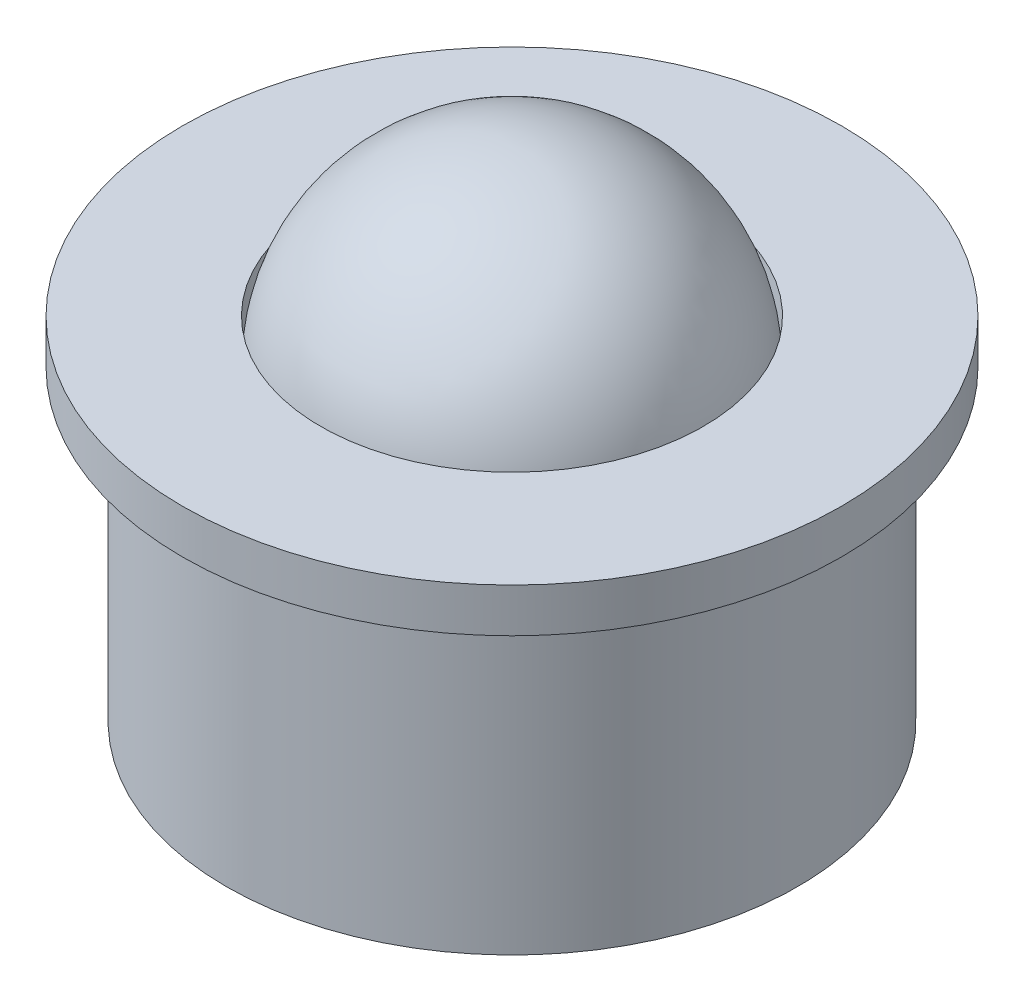
ISO-10303-21;
HEADER;
FILE_DESCRIPTION(('STEP AP214'),'2;1');
FILE_NAME('part.step','',(''),(''),'','','');
FILE_SCHEMA(('AUTOMOTIVE_DESIGN { 1 0 10303 214 1 1 1 1 }'));
ENDSEC;
DATA;
#1=APPLICATION_CONTEXT('core data for automotive mechanical design processes');
#2=APPLICATION_PROTOCOL_DEFINITION('international standard','automotive_design',2000,#1);
#3=PRODUCT_CONTEXT('',#1,'mechanical');
#4=PRODUCT('Part','Part','',(#3));
#5=PRODUCT_RELATED_PRODUCT_CATEGORY('part','',(#4));
#6=PRODUCT_DEFINITION_FORMATION('','',#4);
#7=PRODUCT_DEFINITION_CONTEXT('part definition',#1,'design');
#8=PRODUCT_DEFINITION('design','',#6,#7);
#9=PRODUCT_DEFINITION_SHAPE('','',#8);
#10=(LENGTH_UNIT() NAMED_UNIT(*) SI_UNIT(.MILLI.,.METRE.));
#11=(NAMED_UNIT(*) PLANE_ANGLE_UNIT() SI_UNIT($,.RADIAN.));
#12=(NAMED_UNIT(*) SI_UNIT($,.STERADIAN.) SOLID_ANGLE_UNIT());
#13=UNCERTAINTY_MEASURE_WITH_UNIT(LENGTH_MEASURE(1.E-05),#10,'distance_accuracy_value','');
#14=(GEOMETRIC_REPRESENTATION_CONTEXT(3) GLOBAL_UNCERTAINTY_ASSIGNED_CONTEXT((#13)) GLOBAL_UNIT_ASSIGNED_CONTEXT((#10,
#11,#12)) REPRESENTATION_CONTEXT('',''));
#15=CARTESIAN_POINT('',(0.,0.,0.));
#16=DIRECTION('',(0.,0.,1.));
#17=DIRECTION('',(1.,0.,0.));
#18=AXIS2_PLACEMENT_3D('',#15,#16,#17);
#19=CARTESIAN_POINT('',(0.,0.,0.));
#20=DIRECTION('',(0.,-1.,0.));
#21=DIRECTION('',(0.,0.,-1.));
#22=AXIS2_PLACEMENT_3D('',#19,#20,#21);
#23=PLANE('',#22);
#24=CARTESIAN_POINT('',(0.,0.,0.));
#25=DIRECTION('',(0.,-1.,0.));
#26=DIRECTION('',(0.,0.,-1.));
#27=AXIS2_PLACEMENT_3D('',#24,#25,#26);
#28=CIRCLE('',#27,4.355);
#29=CARTESIAN_POINT('',(0.,0.,-4.355));
#30=VERTEX_POINT('',#29);
#31=EDGE_CURVE('E57',#30,#30,#28,.T.);
#32=ORIENTED_EDGE('',*,*,#31,.F.);
#33=EDGE_LOOP('',(#32));
#34=FACE_BOUND('',#33,.T.);
#35=CARTESIAN_POINT('',(0.,0.,0.));
#36=DIRECTION('',(0.,-1.,0.));
#37=DIRECTION('',(0.,0.,-1.));
#38=AXIS2_PLACEMENT_3D('',#35,#36,#37);
#39=CIRCLE('',#38,5.5);
#40=CARTESIAN_POINT('',(0.,0.,-5.5));
#41=VERTEX_POINT('',#40);
#42=EDGE_CURVE('E72',#41,#41,#39,.T.);
#43=ORIENTED_EDGE('',*,*,#42,.T.);
#44=EDGE_LOOP('',(#43));
#45=FACE_BOUND('',#44,.T.);
#46=ADVANCED_FACE('F53',(#34,#45),#23,.T.);
#47=CARTESIAN_POINT('',(0.,1.,0.));
#48=DIRECTION('',(0.,-1.,0.));
#49=DIRECTION('',(0.,0.,-1.));
#50=AXIS2_PLACEMENT_3D('',#47,#48,#49);
#51=CYLINDRICAL_SURFACE('',#50,7.5);
#52=CARTESIAN_POINT('',(0.,1.,0.));
#53=DIRECTION('',(0.,-1.,0.));
#54=DIRECTION('',(0.,0.,-1.));
#55=AXIS2_PLACEMENT_3D('',#52,#53,#54);
#56=CIRCLE('',#55,7.5);
#57=CARTESIAN_POINT('',(0.,1.00000000000005,-7.49999999999999));
#58=VERTEX_POINT('',#57);
#59=EDGE_CURVE('E68',#58,#58,#56,.T.);
#60=ORIENTED_EDGE('',*,*,#59,.T.);
#61=EDGE_LOOP('',(#60));
#62=FACE_BOUND('',#61,.T.);
#63=CARTESIAN_POINT('',(0.,0.,0.));
#64=DIRECTION('',(0.,-1.,0.));
#65=DIRECTION('',(0.,0.,-1.));
#66=AXIS2_PLACEMENT_3D('',#63,#64,#65);
#67=CIRCLE('',#66,7.5);
#68=CARTESIAN_POINT('',(0.,0.,-7.5));
#69=VERTEX_POINT('',#68);
#70=EDGE_CURVE('E76',#69,#69,#67,.T.);
#71=ORIENTED_EDGE('',*,*,#70,.F.);
#72=EDGE_LOOP('',(#71));
#73=FACE_BOUND('',#72,.T.);
#74=ADVANCED_FACE('F55',(#62,#73),#51,.T.);
#75=CARTESIAN_POINT('',(0.,1.,0.));
#76=DIRECTION('',(0.,-1.,0.));
#77=DIRECTION('',(0.,0.,-1.));
#78=AXIS2_PLACEMENT_3D('',#75,#76,#77);
#79=CYLINDRICAL_SURFACE('',#78,4.355);
#80=CARTESIAN_POINT('',(0.,1.,0.));
#81=DIRECTION('',(0.,-1.,0.));
#82=DIRECTION('',(0.,0.,-1.));
#83=AXIS2_PLACEMENT_3D('',#80,#81,#82);
#84=CIRCLE('',#83,4.355);
#85=CARTESIAN_POINT('',(0.,1.00000000000003,-4.35499999999999));
#86=VERTEX_POINT('',#85);
#87=EDGE_CURVE('E62',#86,#86,#84,.T.);
#88=ORIENTED_EDGE('',*,*,#87,.F.);
#89=EDGE_LOOP('',(#88));
#90=FACE_BOUND('',#89,.T.);
#91=ORIENTED_EDGE('',*,*,#31,.T.);
#92=EDGE_LOOP('',(#91));
#93=FACE_BOUND('',#92,.T.);
#94=ADVANCED_FACE('F121',(#90,#93),#79,.F.);
#95=CARTESIAN_POINT('',(0.,1.,0.));
#96=DIRECTION('',(0.,-1.,0.));
#97=DIRECTION('',(0.,0.,-1.));
#98=AXIS2_PLACEMENT_3D('',#95,#96,#97);
#99=PLANE('',#98);
#100=ORIENTED_EDGE('',*,*,#59,.F.);
#101=EDGE_LOOP('',(#100));
#102=FACE_BOUND('',#101,.T.);
#103=ORIENTED_EDGE('',*,*,#87,.T.);
#104=EDGE_LOOP('',(#103));
#105=FACE_BOUND('',#104,.T.);
#106=ADVANCED_FACE('F111',(#102,#105),#99,.F.);
#107=CARTESIAN_POINT('',(0.,0.,0.));
#108=DIRECTION('',(0.,-1.,0.));
#109=DIRECTION('',(0.,0.,-1.));
#110=AXIS2_PLACEMENT_3D('',#107,#108,#109);
#111=CIRCLE('',#110,6.5);
#112=CARTESIAN_POINT('',(0.,0.,-6.5));
#113=VERTEX_POINT('',#112);
#114=EDGE_CURVE('E11',#113,#113,#111,.T.);
#115=ORIENTED_EDGE('',*,*,#114,.F.);
#116=EDGE_LOOP('',(#115));
#117=FACE_BOUND('',#116,.T.);
#118=ORIENTED_EDGE('',*,*,#70,.T.);
#119=EDGE_LOOP('',(#118));
#120=FACE_BOUND('',#119,.T.);
#121=ADVANCED_FACE('F102',(#117,#120),#23,.T.);
#122=CARTESIAN_POINT('',(0.,-7.,0.));
#123=DIRECTION('',(0.,1.,0.));
#124=DIRECTION('',(0.,0.,1.));
#125=AXIS2_PLACEMENT_3D('',#122,#123,#124);
#126=CYLINDRICAL_SURFACE('',#125,5.5);
#127=CARTESIAN_POINT('',(0.,-7.,0.));
#128=DIRECTION('',(0.,-1.,0.));
#129=DIRECTION('',(0.,0.,-1.));
#130=AXIS2_PLACEMENT_3D('',#127,#128,#129);
#131=CIRCLE('',#130,5.5);
#132=CARTESIAN_POINT('',(0.,-6.99999999999996,-5.50000000000005));
#133=VERTEX_POINT('',#132);
#134=EDGE_CURVE('E86',#133,#133,#131,.T.);
#135=ORIENTED_EDGE('',*,*,#134,.T.);
#136=EDGE_LOOP('',(#135));
#137=FACE_BOUND('',#136,.T.);
#138=ORIENTED_EDGE('',*,*,#42,.F.);
#139=EDGE_LOOP('',(#138));
#140=FACE_BOUND('',#139,.T.);
#141=ADVANCED_FACE('F99',(#137,#140),#126,.F.);
#142=CARTESIAN_POINT('',(0.,-7.,0.));
#143=DIRECTION('',(0.,1.,0.));
#144=DIRECTION('',(0.,0.,1.));
#145=AXIS2_PLACEMENT_3D('',#142,#143,#144);
#146=CYLINDRICAL_SURFACE('',#145,6.5);
#147=CARTESIAN_POINT('',(0.,-7.,0.));
#148=DIRECTION('',(0.,-1.,0.));
#149=DIRECTION('',(0.,0.,-1.));
#150=AXIS2_PLACEMENT_3D('',#147,#148,#149);
#151=CIRCLE('',#150,6.5);
#152=CARTESIAN_POINT('',(0.,-6.99999999999995,-6.50000000000005));
#153=VERTEX_POINT('',#152);
#154=EDGE_CURVE('E79',#153,#153,#151,.T.);
#155=ORIENTED_EDGE('',*,*,#154,.F.);
#156=EDGE_LOOP('',(#155));
#157=FACE_BOUND('',#156,.T.);
#158=ORIENTED_EDGE('',*,*,#114,.T.);
#159=EDGE_LOOP('',(#158));
#160=FACE_BOUND('',#159,.T.);
#161=ADVANCED_FACE('F101',(#157,#160),#146,.T.);
#162=CARTESIAN_POINT('',(0.,-7.,0.));
#163=DIRECTION('',(0.,-1.,0.));
#164=DIRECTION('',(0.,0.,-1.));
#165=AXIS2_PLACEMENT_3D('',#162,#163,#164);
#166=PLANE('',#165);
#167=ORIENTED_EDGE('',*,*,#134,.F.);
#168=EDGE_LOOP('',(#167));
#169=FACE_BOUND('',#168,.T.);
#170=ORIENTED_EDGE('',*,*,#154,.T.);
#171=EDGE_LOOP('',(#170));
#172=FACE_BOUND('',#171,.T.);
#173=ADVANCED_FACE('F108',(#169,#172),#166,.T.);
#174=CLOSED_SHELL('',(#46,#74,#94,#106,#121,#141,#161,#173));
#175=MANIFOLD_SOLID_BREP('B2',#174);
#176=CARTESIAN_POINT('',(0.,0.,0.));
#177=DIRECTION('',(-1.,0.,0.));
#178=DIRECTION('',(0.,0.,-1.));
#179=AXIS2_PLACEMENT_3D('',#176,#177,#178);
#180=SPHERICAL_SURFACE('',#179,4.355);
#181=CARTESIAN_POINT('',(0.,0.,0.));
#182=DIRECTION('',(0.,-1.,0.));
#183=DIRECTION('',(0.,0.,-1.));
#184=AXIS2_PLACEMENT_3D('',#181,#182,#183);
#185=SPHERICAL_SURFACE('',#184,4.355);
#186=CARTESIAN_POINT('',(0.,0.,0.));
#187=DIRECTION('',(0.,-1.,0.));
#188=DIRECTION('',(0.,0.,-1.));
#189=AXIS2_PLACEMENT_3D('',#186,#187,#188);
#190=CIRCLE('',#189,4.355);
#191=CARTESIAN_POINT('',(0.,0.,-4.355));
#192=VERTEX_POINT('',#191);
#193=EDGE_CURVE('E52',#192,#192,#190,.T.);
#194=ORIENTED_EDGE('',*,*,#193,.F.);
#195=EDGE_LOOP('',(#194));
#196=FACE_BOUND('',#195,.T.);
#197=ADVANCED_FACE('F191',(#196),#185,.T.);
#198=CARTESIAN_POINT('',(0.,0.,0.));
#199=DIRECTION('',(0.,-1.,0.));
#200=DIRECTION('',(0.,0.,-1.));
#201=AXIS2_PLACEMENT_3D('',#198,#199,#200);
#202=PLANE('',#201);
#203=ORIENTED_EDGE('',*,*,#193,.T.);
#204=EDGE_LOOP('',(#203));
#205=FACE_BOUND('',#204,.T.);
#206=ADVANCED_FACE('F198',(#205),#202,.T.);
#207=CLOSED_SHELL('',(#197,#206));
#208=MANIFOLD_SOLID_BREP('B6',#207);
#209=ADVANCED_BREP_SHAPE_REPRESENTATION('',(#18,#175,#208),#14);
#210=SHAPE_DEFINITION_REPRESENTATION(#9,#209);
ENDSEC;
END-ISO-10303-21;
